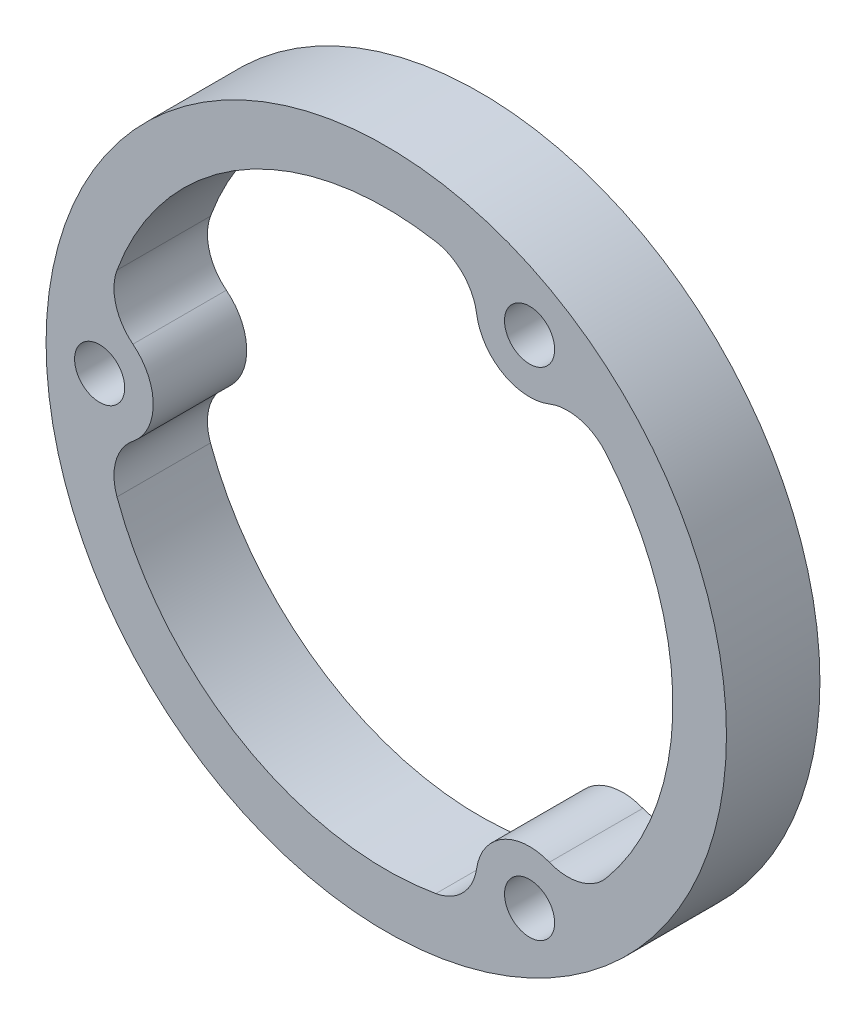
ISO-10303-21;
HEADER;
FILE_DESCRIPTION(('STEP AP214'),'2;1');
FILE_NAME('part.step','',(''),(''),'','','');
FILE_SCHEMA(('AUTOMOTIVE_DESIGN { 1 0 10303 214 1 1 1 1 }'));
ENDSEC;
DATA;
#1=APPLICATION_CONTEXT('core data for automotive mechanical design processes');
#2=APPLICATION_PROTOCOL_DEFINITION('international standard','automotive_design',2000,#1);
#3=PRODUCT_CONTEXT('',#1,'mechanical');
#4=PRODUCT('Part','Part','',(#3));
#5=PRODUCT_RELATED_PRODUCT_CATEGORY('part','',(#4));
#6=PRODUCT_DEFINITION_FORMATION('','',#4);
#7=PRODUCT_DEFINITION_CONTEXT('part definition',#1,'design');
#8=PRODUCT_DEFINITION('design','',#6,#7);
#9=PRODUCT_DEFINITION_SHAPE('','',#8);
#10=(LENGTH_UNIT() NAMED_UNIT(*) SI_UNIT(.MILLI.,.METRE.));
#11=(NAMED_UNIT(*) PLANE_ANGLE_UNIT() SI_UNIT($,.RADIAN.));
#12=(NAMED_UNIT(*) SI_UNIT($,.STERADIAN.) SOLID_ANGLE_UNIT());
#13=UNCERTAINTY_MEASURE_WITH_UNIT(LENGTH_MEASURE(1.E-05),#10,'distance_accuracy_value','');
#14=(GEOMETRIC_REPRESENTATION_CONTEXT(3) GLOBAL_UNCERTAINTY_ASSIGNED_CONTEXT((#13)) GLOBAL_UNIT_ASSIGNED_CONTEXT((#10,
#11,#12)) REPRESENTATION_CONTEXT('',''));
#15=CARTESIAN_POINT('',(0.,0.,0.));
#16=DIRECTION('',(0.,0.,1.));
#17=DIRECTION('',(1.,0.,0.));
#18=AXIS2_PLACEMENT_3D('',#15,#16,#17);
#19=CARTESIAN_POINT('',(0.,0.,9.525));
#20=DIRECTION('',(0.,0.,1.));
#21=DIRECTION('',(1.,0.,0.));
#22=AXIS2_PLACEMENT_3D('',#19,#20,#21);
#23=PLANE('',#22);
#24=CARTESIAN_POINT('',(14.6049999999998,25.2966020445436,9.525));
#25=DIRECTION('',(0.,0.,1.));
#26=DIRECTION('',(1.,0.,0.));
#27=AXIS2_PLACEMENT_3D('',#24,#25,#26);
#28=CIRCLE('',#27,2.5527);
#29=CARTESIAN_POINT('',(17.1576999999998,25.2966020445436,9.525));
#30=VERTEX_POINT('',#29);
#31=EDGE_CURVE('E484',#30,#30,#28,.T.);
#32=ORIENTED_EDGE('',*,*,#31,.F.);
#33=EDGE_LOOP('',(#32));
#34=FACE_BOUND('',#33,.T.);
#35=CARTESIAN_POINT('',(-29.2100000000011,1.58843043085777E-12,9.525));
#36=DIRECTION('',(0.,0.,1.));
#37=DIRECTION('',(1.,0.,0.));
#38=AXIS2_PLACEMENT_3D('',#35,#36,#37);
#39=CIRCLE('',#38,2.5527);
#40=CARTESIAN_POINT('',(-26.6573000000011,1.58843043085777E-12,9.525));
#41=VERTEX_POINT('',#40);
#42=EDGE_CURVE('E488',#41,#41,#39,.T.);
#43=ORIENTED_EDGE('',*,*,#42,.F.);
#44=EDGE_LOOP('',(#43));
#45=FACE_BOUND('',#44,.T.);
#46=CARTESIAN_POINT('',(14.6049999999981,-25.2966020445433,9.525));
#47=DIRECTION('',(0.,0.,1.));
#48=DIRECTION('',(1.,0.,0.));
#49=AXIS2_PLACEMENT_3D('',#46,#47,#48);
#50=CIRCLE('',#49,2.5527);
#51=CARTESIAN_POINT('',(17.1576999999981,-25.2966020445433,9.525));
#52=VERTEX_POINT('',#51);
#53=EDGE_CURVE('E501',#52,#52,#50,.T.);
#54=ORIENTED_EDGE('',*,*,#53,.F.);
#55=EDGE_LOOP('',(#54));
#56=FACE_BOUND('',#55,.T.);
#57=CARTESIAN_POINT('',(0.,0.,9.525));
#58=DIRECTION('',(0.,0.,1.));
#59=DIRECTION('',(1.,0.,0.));
#60=AXIS2_PLACEMENT_3D('',#57,#58,#59);
#61=CIRCLE('',#60,34.671);
#62=CARTESIAN_POINT('',(-34.671,0.,9.525));
#63=VERTEX_POINT('',#62);
#64=EDGE_CURVE('E153',#63,#63,#61,.T.);
#65=ORIENTED_EDGE('',*,*,#64,.T.);
#66=EDGE_LOOP('',(#65));
#67=FACE_BOUND('',#66,.T.);
#68=CARTESIAN_POINT('',(-29.21,-4.21584989140911E-13,9.525));
#69=DIRECTION('',(0.,0.,-1.));
#70=DIRECTION('',(1.,0.,0.));
#71=AXIS2_PLACEMENT_3D('',#68,#69,#70);
#72=CIRCLE('',#71,5.46100000000001);
#73=CARTESIAN_POINT('',(-25.8216912257727,4.28274265517914,9.525));
#74=VERTEX_POINT('',#73);
#75=CARTESIAN_POINT('',(-25.8216912257726,-4.28274265517988,9.525));
#76=VERTEX_POINT('',#75);
#77=EDGE_CURVE('E214',#74,#76,#72,.T.);
#78=ORIENTED_EDGE('',*,*,#77,.F.);
#79=CARTESIAN_POINT('',(-22.6697760869566,8.26668931116012,9.525));
#80=DIRECTION('',(0.,0.,1.));
#81=DIRECTION('',(1.,0.,0.));
#82=AXIS2_PLACEMENT_3D('',#79,#80,#81);
#83=CIRCLE('',#82,5.08);
#84=CARTESIAN_POINT('',(-27.4423605263159,10.0070449556149,9.525));
#85=VERTEX_POINT('',#84);
#86=EDGE_CURVE('E198',#74,#85,#83,.F.);
#87=ORIENTED_EDGE('',*,*,#86,.T.);
#88=CARTESIAN_POINT('',(0.,0.,9.525));
#89=DIRECTION('',(0.,0.,1.));
#90=DIRECTION('',(1.,0.,0.));
#91=AXIS2_PLACEMENT_3D('',#88,#89,#90);
#92=CIRCLE('',#91,29.21);
#93=CARTESIAN_POINT('',(5.05482511478187,28.7693038334085,9.525));
#94=VERTEX_POINT('',#93);
#95=EDGE_CURVE('E149',#94,#85,#92,.T.);
#96=ORIENTED_EDGE('',*,*,#95,.F.);
#97=CARTESIAN_POINT('',(4.1757250948198,23.7659466449896,9.525));
#98=DIRECTION('',(0.,0.,1.));
#99=DIRECTION('',(1.,0.,0.));
#100=AXIS2_PLACEMENT_3D('',#97,#98,#99);
#101=CIRCLE('',#100,5.08);
#102=CARTESIAN_POINT('',(9.20188167562942,24.5036118977867,9.525));
#103=VERTEX_POINT('',#102);
#104=EDGE_CURVE('E139',#94,#103,#101,.F.);
#105=ORIENTED_EDGE('',*,*,#104,.T.);
#106=CARTESIAN_POINT('',(14.6049999999998,25.2966020445436,9.525));
#107=DIRECTION('',(0.,0.,-1.));
#108=DIRECTION('',(1.,0.,0.));
#109=AXIS2_PLACEMENT_3D('',#106,#107,#108);
#110=CIRCLE('',#109,5.46100000000001);
#111=CARTESIAN_POINT('',(16.6198095501428,20.2208692426073,9.525));
#112=VERTEX_POINT('',#111);
#113=EDGE_CURVE('E229',#112,#103,#110,.T.);
#114=ORIENTED_EDGE('',*,*,#113,.F.);
#115=CARTESIAN_POINT('',(18.4940509921363,15.4992573338293,9.525));
#116=DIRECTION('',(0.,0.,1.));
#117=DIRECTION('',(1.,0.,0.));
#118=AXIS2_PLACEMENT_3D('',#115,#116,#117);
#119=CIRCLE('',#118,5.08);
#120=CARTESIAN_POINT('',(22.3875354115334,18.7622588777934,9.525));
#121=VERTEX_POINT('',#120);
#122=EDGE_CURVE('E138',#112,#121,#119,.F.);
#123=ORIENTED_EDGE('',*,*,#122,.T.);
#124=CARTESIAN_POINT('',(0.,0.,9.525));
#125=DIRECTION('',(0.,0.,1.));
#126=DIRECTION('',(1.,0.,0.));
#127=AXIS2_PLACEMENT_3D('',#124,#125,#126);
#128=CIRCLE('',#127,29.21);
#129=CARTESIAN_POINT('',(22.3875354115337,-18.762258877793,9.525));
#130=VERTEX_POINT('',#129);
#131=EDGE_CURVE('E226',#130,#121,#128,.T.);
#132=ORIENTED_EDGE('',*,*,#131,.F.);
#133=CARTESIAN_POINT('',(18.4940509921366,-15.499257333829,9.525));
#134=DIRECTION('',(0.,0.,1.));
#135=DIRECTION('',(1.,0.,0.));
#136=AXIS2_PLACEMENT_3D('',#133,#134,#135);
#137=CIRCLE('',#136,5.08);
#138=CARTESIAN_POINT('',(16.6198095501431,-20.220869242607,9.525));
#139=VERTEX_POINT('',#138);
#140=EDGE_CURVE('E194',#130,#139,#137,.F.);
#141=ORIENTED_EDGE('',*,*,#140,.T.);
#142=CARTESIAN_POINT('',(14.6050000000001,-25.2966020445434,9.525));
#143=DIRECTION('',(0.,0.,-1.));
#144=DIRECTION('',(1.,0.,0.));
#145=AXIS2_PLACEMENT_3D('',#142,#143,#144);
#146=CIRCLE('',#145,5.46100000000001);
#147=CARTESIAN_POINT('',(9.20188167562977,-24.5036118977866,9.525));
#148=VERTEX_POINT('',#147);
#149=EDGE_CURVE('E218',#148,#139,#146,.T.);
#150=ORIENTED_EDGE('',*,*,#149,.F.);
#151=CARTESIAN_POINT('',(4.17572509482014,-23.7659466449895,9.525));
#152=DIRECTION('',(0.,0.,1.));
#153=DIRECTION('',(1.,0.,0.));
#154=AXIS2_PLACEMENT_3D('',#151,#152,#153);
#155=CIRCLE('',#154,5.08);
#156=CARTESIAN_POINT('',(5.05482511478227,-28.7693038334084,9.525));
#157=VERTEX_POINT('',#156);
#158=EDGE_CURVE('E190',#148,#157,#155,.F.);
#159=ORIENTED_EDGE('',*,*,#158,.T.);
#160=CARTESIAN_POINT('',(0.,0.,9.525));
#161=DIRECTION('',(0.,0.,1.));
#162=DIRECTION('',(1.,0.,0.));
#163=AXIS2_PLACEMENT_3D('',#160,#161,#162);
#164=CIRCLE('',#163,29.21);
#165=CARTESIAN_POINT('',(-27.4423605263156,-10.0070449556157,9.525));
#166=VERTEX_POINT('',#165);
#167=EDGE_CURVE('E216',#166,#157,#164,.T.);
#168=ORIENTED_EDGE('',*,*,#167,.F.);
#169=CARTESIAN_POINT('',(-22.6697760869564,-8.26668931116077,9.525));
#170=DIRECTION('',(0.,0.,1.));
#171=DIRECTION('',(1.,0.,0.));
#172=AXIS2_PLACEMENT_3D('',#169,#170,#171);
#173=CIRCLE('',#172,5.08);
#174=EDGE_CURVE('E12',#166,#76,#173,.F.);
#175=ORIENTED_EDGE('',*,*,#174,.T.);
#176=EDGE_LOOP('',(#78,#87,#96,#105,#114,#123,#132,#141,#150,#159,#168,#175));
#177=FACE_BOUND('',#176,.T.);
#178=ADVANCED_FACE('F39',(#34,#45,#56,#67,#177),#23,.T.);
#179=CARTESIAN_POINT('',(0.,0.,0.));
#180=DIRECTION('',(0.,0.,1.));
#181=DIRECTION('',(1.,0.,0.));
#182=AXIS2_PLACEMENT_3D('',#179,#180,#181);
#183=PLANE('',#182);
#184=CARTESIAN_POINT('',(14.6049999999998,25.2966020445436,0.));
#185=DIRECTION('',(0.,0.,-1.));
#186=DIRECTION('',(-1.,0.,0.));
#187=AXIS2_PLACEMENT_3D('',#184,#185,#186);
#188=CIRCLE('',#187,4.0005);
#189=CARTESIAN_POINT('',(10.6044999999998,25.2966020445436,0.));
#190=VERTEX_POINT('',#189);
#191=EDGE_CURVE('E507',#190,#190,#188,.T.);
#192=ORIENTED_EDGE('',*,*,#191,.F.);
#193=EDGE_LOOP('',(#192));
#194=FACE_BOUND('',#193,.T.);
#195=CARTESIAN_POINT('',(-29.2100000000011,1.58931775184226E-12,0.));
#196=DIRECTION('',(0.,0.,-1.));
#197=DIRECTION('',(-1.,0.,0.));
#198=AXIS2_PLACEMENT_3D('',#195,#196,#197);
#199=CIRCLE('',#198,4.00050000000221);
#200=CARTESIAN_POINT('',(-33.2105000000033,1.58931775184226E-12,0.));
#201=VERTEX_POINT('',#200);
#202=EDGE_CURVE('E513',#201,#201,#199,.T.);
#203=ORIENTED_EDGE('',*,*,#202,.F.);
#204=EDGE_LOOP('',(#203));
#205=FACE_BOUND('',#204,.T.);
#206=CARTESIAN_POINT('',(14.6049999999981,-25.2966020445433,0.));
#207=DIRECTION('',(0.,0.,-1.));
#208=DIRECTION('',(-1.,0.,0.));
#209=AXIS2_PLACEMENT_3D('',#206,#207,#208);
#210=CIRCLE('',#209,4.00050000000186);
#211=CARTESIAN_POINT('',(10.6044999999962,-25.2966020445433,0.));
#212=VERTEX_POINT('',#211);
#213=EDGE_CURVE('E504',#212,#212,#210,.T.);
#214=ORIENTED_EDGE('',*,*,#213,.F.);
#215=EDGE_LOOP('',(#214));
#216=FACE_BOUND('',#215,.T.);
#217=CARTESIAN_POINT('',(0.,0.,0.));
#218=DIRECTION('',(0.,0.,1.));
#219=DIRECTION('',(1.,0.,0.));
#220=AXIS2_PLACEMENT_3D('',#217,#218,#219);
#221=CIRCLE('',#220,34.671);
#222=CARTESIAN_POINT('',(-34.671,0.,0.));
#223=VERTEX_POINT('',#222);
#224=EDGE_CURVE('E158',#223,#223,#221,.T.);
#225=ORIENTED_EDGE('',*,*,#224,.F.);
#226=EDGE_LOOP('',(#225));
#227=FACE_BOUND('',#226,.T.);
#228=CARTESIAN_POINT('',(14.6049999999998,25.2966020445436,0.));
#229=DIRECTION('',(0.,0.,-1.));
#230=DIRECTION('',(1.,0.,0.));
#231=AXIS2_PLACEMENT_3D('',#228,#229,#230);
#232=CIRCLE('',#231,5.46100000000001);
#233=CARTESIAN_POINT('',(16.6198095501428,20.2208692426073,0.));
#234=VERTEX_POINT('',#233);
#235=CARTESIAN_POINT('',(9.20188167562942,24.5036118977867,0.));
#236=VERTEX_POINT('',#235);
#237=EDGE_CURVE('E131',#234,#236,#232,.T.);
#238=ORIENTED_EDGE('',*,*,#237,.T.);
#239=CARTESIAN_POINT('',(4.1757250948198,23.7659466449896,0.));
#240=DIRECTION('',(0.,0.,1.));
#241=DIRECTION('',(1.,0.,0.));
#242=AXIS2_PLACEMENT_3D('',#239,#240,#241);
#243=CIRCLE('',#242,5.08);
#244=CARTESIAN_POINT('',(5.05482511478187,28.7693038334085,0.));
#245=VERTEX_POINT('',#244);
#246=EDGE_CURVE('E184',#236,#245,#243,.T.);
#247=ORIENTED_EDGE('',*,*,#246,.T.);
#248=CARTESIAN_POINT('',(0.,0.,0.));
#249=DIRECTION('',(0.,0.,1.));
#250=DIRECTION('',(1.,0.,0.));
#251=AXIS2_PLACEMENT_3D('',#248,#249,#250);
#252=CIRCLE('',#251,29.21);
#253=CARTESIAN_POINT('',(-27.4423605263159,10.0070449556149,0.));
#254=VERTEX_POINT('',#253);
#255=EDGE_CURVE('E231',#245,#254,#252,.T.);
#256=ORIENTED_EDGE('',*,*,#255,.T.);
#257=CARTESIAN_POINT('',(-22.6697760869566,8.26668931116012,0.));
#258=DIRECTION('',(0.,0.,1.));
#259=DIRECTION('',(1.,0.,0.));
#260=AXIS2_PLACEMENT_3D('',#257,#258,#259);
#261=CIRCLE('',#260,5.08);
#262=CARTESIAN_POINT('',(-25.8216912257727,4.28274265517914,0.));
#263=VERTEX_POINT('',#262);
#264=EDGE_CURVE('E196',#254,#263,#261,.T.);
#265=ORIENTED_EDGE('',*,*,#264,.T.);
#266=CARTESIAN_POINT('',(-29.21,-4.21584989140911E-13,0.));
#267=DIRECTION('',(0.,0.,-1.));
#268=DIRECTION('',(1.,0.,0.));
#269=AXIS2_PLACEMENT_3D('',#266,#267,#268);
#270=CIRCLE('',#269,5.46100000000001);
#271=CARTESIAN_POINT('',(-25.8216912257726,-4.28274265517988,0.));
#272=VERTEX_POINT('',#271);
#273=EDGE_CURVE('E203',#263,#272,#270,.T.);
#274=ORIENTED_EDGE('',*,*,#273,.T.);
#275=CARTESIAN_POINT('',(-22.6697760869564,-8.26668931116077,0.));
#276=DIRECTION('',(0.,0.,1.));
#277=DIRECTION('',(1.,0.,0.));
#278=AXIS2_PLACEMENT_3D('',#275,#276,#277);
#279=CIRCLE('',#278,5.08);
#280=CARTESIAN_POINT('',(-27.4423605263156,-10.0070449556157,0.));
#281=VERTEX_POINT('',#280);
#282=EDGE_CURVE('E47',#272,#281,#279,.T.);
#283=ORIENTED_EDGE('',*,*,#282,.T.);
#284=CARTESIAN_POINT('',(0.,0.,0.));
#285=DIRECTION('',(0.,0.,1.));
#286=DIRECTION('',(1.,0.,0.));
#287=AXIS2_PLACEMENT_3D('',#284,#285,#286);
#288=CIRCLE('',#287,29.21);
#289=CARTESIAN_POINT('',(5.05482511478227,-28.7693038334084,0.));
#290=VERTEX_POINT('',#289);
#291=EDGE_CURVE('E202',#281,#290,#288,.T.);
#292=ORIENTED_EDGE('',*,*,#291,.T.);
#293=CARTESIAN_POINT('',(4.17572509482014,-23.7659466449895,0.));
#294=DIRECTION('',(0.,0.,1.));
#295=DIRECTION('',(1.,0.,0.));
#296=AXIS2_PLACEMENT_3D('',#293,#294,#295);
#297=CIRCLE('',#296,5.08);
#298=CARTESIAN_POINT('',(9.20188167562977,-24.5036118977866,0.));
#299=VERTEX_POINT('',#298);
#300=EDGE_CURVE('E188',#290,#299,#297,.T.);
#301=ORIENTED_EDGE('',*,*,#300,.T.);
#302=CARTESIAN_POINT('',(14.6050000000001,-25.2966020445434,0.));
#303=DIRECTION('',(0.,0.,-1.));
#304=DIRECTION('',(1.,0.,0.));
#305=AXIS2_PLACEMENT_3D('',#302,#303,#304);
#306=CIRCLE('',#305,5.46100000000001);
#307=CARTESIAN_POINT('',(16.6198095501431,-20.220869242607,0.));
#308=VERTEX_POINT('',#307);
#309=EDGE_CURVE('E211',#299,#308,#306,.T.);
#310=ORIENTED_EDGE('',*,*,#309,.T.);
#311=CARTESIAN_POINT('',(18.4940509921366,-15.499257333829,0.));
#312=DIRECTION('',(0.,0.,1.));
#313=DIRECTION('',(1.,0.,0.));
#314=AXIS2_PLACEMENT_3D('',#311,#312,#313);
#315=CIRCLE('',#314,5.08);
#316=CARTESIAN_POINT('',(22.3875354115337,-18.762258877793,0.));
#317=VERTEX_POINT('',#316);
#318=EDGE_CURVE('E192',#308,#317,#315,.T.);
#319=ORIENTED_EDGE('',*,*,#318,.T.);
#320=CARTESIAN_POINT('',(0.,0.,0.));
#321=DIRECTION('',(0.,0.,1.));
#322=DIRECTION('',(1.,0.,0.));
#323=AXIS2_PLACEMENT_3D('',#320,#321,#322);
#324=CIRCLE('',#323,29.21);
#325=CARTESIAN_POINT('',(22.3875354115334,18.7622588777934,0.));
#326=VERTEX_POINT('',#325);
#327=EDGE_CURVE('E133',#317,#326,#324,.T.);
#328=ORIENTED_EDGE('',*,*,#327,.T.);
#329=CARTESIAN_POINT('',(18.4940509921363,15.4992573338293,0.));
#330=DIRECTION('',(0.,0.,1.));
#331=DIRECTION('',(1.,0.,0.));
#332=AXIS2_PLACEMENT_3D('',#329,#330,#331);
#333=CIRCLE('',#332,5.08);
#334=EDGE_CURVE('E128',#326,#234,#333,.T.);
#335=ORIENTED_EDGE('',*,*,#334,.T.);
#336=EDGE_LOOP('',(#238,#247,#256,#265,#274,#283,#292,#301,#310,#319,#328,#335));
#337=FACE_BOUND('',#336,.T.);
#338=ADVANCED_FACE('F130',(#194,#205,#216,#227,#337),#183,.F.);
#339=CARTESIAN_POINT('',(0.,0.,9.525));
#340=DIRECTION('',(0.,0.,-1.));
#341=DIRECTION('',(-1.,0.,0.));
#342=AXIS2_PLACEMENT_3D('',#339,#340,#341);
#343=CYLINDRICAL_SURFACE('',#342,34.671);
#344=CARTESIAN_POINT('',(-34.671,0.,9.525));
#345=CARTESIAN_POINT('',(-34.671,0.,9.42578125));
#346=CARTESIAN_POINT('',(-34.671,0.,9.3265625));
#347=CARTESIAN_POINT('',(-34.671,0.,9.128125));
#348=CARTESIAN_POINT('',(-34.671,0.,9.02890625));
#349=CARTESIAN_POINT('',(-34.671,0.,8.83046875));
#350=CARTESIAN_POINT('',(-34.671,0.,8.73125));
#351=CARTESIAN_POINT('',(-34.671,0.,8.5328125));
#352=CARTESIAN_POINT('',(-34.671,0.,8.43359375));
#353=CARTESIAN_POINT('',(-34.671,0.,8.23515625));
#354=CARTESIAN_POINT('',(-34.671,0.,8.1359375));
#355=CARTESIAN_POINT('',(-34.671,0.,7.9375));
#356=CARTESIAN_POINT('',(-34.671,0.,7.83828125));
#357=CARTESIAN_POINT('',(-34.671,0.,7.63984375));
#358=CARTESIAN_POINT('',(-34.671,0.,7.540625));
#359=CARTESIAN_POINT('',(-34.671,0.,7.3421875));
#360=CARTESIAN_POINT('',(-34.671,0.,7.24296875));
#361=CARTESIAN_POINT('',(-34.671,0.,7.04453125));
#362=CARTESIAN_POINT('',(-34.671,0.,6.9453125));
#363=CARTESIAN_POINT('',(-34.671,0.,6.746875));
#364=CARTESIAN_POINT('',(-34.671,0.,6.64765625));
#365=CARTESIAN_POINT('',(-34.671,0.,6.44921875));
#366=CARTESIAN_POINT('',(-34.671,0.,6.35));
#367=CARTESIAN_POINT('',(-34.671,0.,6.1515625));
#368=CARTESIAN_POINT('',(-34.671,0.,6.05234375));
#369=CARTESIAN_POINT('',(-34.671,0.,5.85390625));
#370=CARTESIAN_POINT('',(-34.671,0.,5.7546875));
#371=CARTESIAN_POINT('',(-34.671,0.,5.55625));
#372=CARTESIAN_POINT('',(-34.671,0.,5.45703125));
#373=CARTESIAN_POINT('',(-34.671,0.,5.25859375));
#374=CARTESIAN_POINT('',(-34.671,0.,5.159375));
#375=CARTESIAN_POINT('',(-34.671,0.,4.9609375));
#376=CARTESIAN_POINT('',(-34.671,0.,4.86171875));
#377=CARTESIAN_POINT('',(-34.671,0.,4.66328125));
#378=CARTESIAN_POINT('',(-34.671,0.,4.5640625));
#379=CARTESIAN_POINT('',(-34.671,0.,4.365625));
#380=CARTESIAN_POINT('',(-34.671,0.,4.26640625));
#381=CARTESIAN_POINT('',(-34.671,0.,4.06796875));
#382=CARTESIAN_POINT('',(-34.671,0.,3.96875));
#383=CARTESIAN_POINT('',(-34.671,0.,3.7703125));
#384=CARTESIAN_POINT('',(-34.671,0.,3.67109375));
#385=CARTESIAN_POINT('',(-34.671,0.,3.47265625));
#386=CARTESIAN_POINT('',(-34.671,0.,3.3734375));
#387=CARTESIAN_POINT('',(-34.671,0.,3.175));
#388=CARTESIAN_POINT('',(-34.671,0.,3.07578125));
#389=CARTESIAN_POINT('',(-34.671,0.,2.87734375));
#390=CARTESIAN_POINT('',(-34.671,0.,2.778125));
#391=CARTESIAN_POINT('',(-34.671,0.,2.5796875));
#392=CARTESIAN_POINT('',(-34.671,0.,2.48046875));
#393=CARTESIAN_POINT('',(-34.671,0.,2.28203125));
#394=CARTESIAN_POINT('',(-34.671,0.,2.1828125));
#395=CARTESIAN_POINT('',(-34.671,0.,1.984375));
#396=CARTESIAN_POINT('',(-34.671,0.,1.88515625));
#397=CARTESIAN_POINT('',(-34.671,0.,1.68671875));
#398=CARTESIAN_POINT('',(-34.671,0.,1.5875));
#399=CARTESIAN_POINT('',(-34.671,0.,1.3890625));
#400=CARTESIAN_POINT('',(-34.671,0.,1.28984375));
#401=CARTESIAN_POINT('',(-34.671,0.,1.09140625));
#402=CARTESIAN_POINT('',(-34.671,0.,0.992187500000001));
#403=CARTESIAN_POINT('',(-34.671,0.,0.793750000000001));
#404=CARTESIAN_POINT('',(-34.671,0.,0.69453125));
#405=CARTESIAN_POINT('',(-34.671,0.,0.49609375));
#406=CARTESIAN_POINT('',(-34.671,0.,0.396875));
#407=CARTESIAN_POINT('',(-34.671,0.,0.1984375));
#408=CARTESIAN_POINT('',(-34.671,0.,0.0992187500000001));
#409=CARTESIAN_POINT('',(-34.671,0.,0.));
#410=B_SPLINE_CURVE_WITH_KNOTS('',3,(#344,#345,#346,#347,#348,#349,#350,#351,#352,#353,#354,
#355,#356,#357,#358,#359,#360,#361,#362,#363,#364,#365,#366,#367,#368,#369,#370,#371,#372,#373,
#374,#375,#376,#377,#378,#379,#380,#381,#382,#383,#384,#385,#386,#387,#388,#389,#390,#391,#392,
#393,#394,#395,#396,#397,#398,#399,#400,#401,#402,#403,#404,#405,#406,#407,#408,#409),
.UNSPECIFIED.,.F.,.F.,(4,2,2,2,2,2,2,2,2,2,2,2,2,2,2,2,2,2,2,2,2,2,2,2,2,2,2,2,2,2,2,2,4),(0.,
0.297656249999998,0.595312499999999,0.892968749999999,1.190625,1.48828125,1.7859375,2.08359375,
2.38125,2.67890625,2.9765625,3.27421875,3.571875,3.86953125,4.1671875,4.46484375,4.7625,
5.06015625,5.3578125,5.65546875,5.953125,6.25078125,6.5484375,6.84609375,7.14375,7.44140625,
7.7390625,8.03671875,8.334375,8.63203125,8.9296875,9.22734375,9.525),.UNSPECIFIED.);
#411=EDGE_CURVE('BSEAM278',#63,#223,#410,.T.);
#412=ORIENTED_EDGE('',*,*,#64,.F.);
#413=ORIENTED_EDGE('',*,*,#224,.T.);
#414=ORIENTED_EDGE('',*,*,#411,.T.);
#415=ORIENTED_EDGE('',*,*,#411,.F.);
#416=EDGE_LOOP('',(#412,#414,#413,#415));
#417=FACE_BOUND('',#416,.T.);
#418=ADVANCED_FACE('F278',(#417),#343,.T.);
#419=CARTESIAN_POINT('',(0.,0.,9.525));
#420=DIRECTION('',(0.,0.,-1.));
#421=DIRECTION('',(-1.,0.,0.));
#422=AXIS2_PLACEMENT_3D('',#419,#420,#421);
#423=CYLINDRICAL_SURFACE('',#422,29.21);
#424=ORIENTED_EDGE('',*,*,#255,.F.);
#425=DIRECTION('',(0.,0.,-1.));
#426=VECTOR('',#425,1.);
#427=CARTESIAN_POINT('',(5.05482511478187,28.7693038334085,9.525));
#428=LINE('',#427,#426);
#429=EDGE_CURVE('E164',#245,#94,#428,.F.);
#430=ORIENTED_EDGE('',*,*,#429,.T.);
#431=ORIENTED_EDGE('',*,*,#95,.T.);
#432=DIRECTION('',(0.,0.,-1.));
#433=VECTOR('',#432,1.);
#434=CARTESIAN_POINT('',(-27.4423605263159,10.0070449556149,9.525));
#435=LINE('',#434,#433);
#436=EDGE_CURVE('E155',#85,#254,#435,.T.);
#437=ORIENTED_EDGE('',*,*,#436,.T.);
#438=EDGE_LOOP('',(#424,#430,#431,#437));
#439=FACE_BOUND('',#438,.T.);
#440=ADVANCED_FACE('F261',(#439),#423,.F.);
#441=CARTESIAN_POINT('',(-29.21,-4.21584989140911E-13,9.525));
#442=DIRECTION('',(0.,0.,-1.));
#443=DIRECTION('',(-1.,0.,0.));
#444=AXIS2_PLACEMENT_3D('',#441,#442,#443);
#445=CYLINDRICAL_SURFACE('',#444,5.46100000000001);
#446=ORIENTED_EDGE('',*,*,#273,.F.);
#447=DIRECTION('',(0.,0.,-1.));
#448=VECTOR('',#447,1.);
#449=CARTESIAN_POINT('',(-25.8216912257727,4.28274265517914,9.525));
#450=LINE('',#449,#448);
#451=EDGE_CURVE('E59',#263,#74,#450,.F.);
#452=ORIENTED_EDGE('',*,*,#451,.T.);
#453=ORIENTED_EDGE('',*,*,#77,.T.);
#454=DIRECTION('',(0.,0.,-1.));
#455=VECTOR('',#454,1.);
#456=CARTESIAN_POINT('',(-25.8216912257726,-4.28274265517988,9.525));
#457=LINE('',#456,#455);
#458=EDGE_CURVE('E180',#76,#272,#457,.T.);
#459=ORIENTED_EDGE('',*,*,#458,.T.);
#460=EDGE_LOOP('',(#446,#452,#453,#459));
#461=FACE_BOUND('',#460,.T.);
#462=ADVANCED_FACE('F213',(#461),#445,.T.);
#463=CARTESIAN_POINT('',(0.,0.,9.525));
#464=DIRECTION('',(0.,0.,-1.));
#465=DIRECTION('',(-1.,0.,0.));
#466=AXIS2_PLACEMENT_3D('',#463,#464,#465);
#467=CYLINDRICAL_SURFACE('',#466,29.21);
#468=ORIENTED_EDGE('',*,*,#167,.T.);
#469=DIRECTION('',(0.,0.,-1.));
#470=VECTOR('',#469,1.);
#471=CARTESIAN_POINT('',(5.05482511478227,-28.7693038334084,9.525));
#472=LINE('',#471,#470);
#473=EDGE_CURVE('E172',#157,#290,#472,.T.);
#474=ORIENTED_EDGE('',*,*,#473,.T.);
#475=ORIENTED_EDGE('',*,*,#291,.F.);
#476=DIRECTION('',(0.,0.,-1.));
#477=VECTOR('',#476,1.);
#478=CARTESIAN_POINT('',(-27.4423605263156,-10.0070449556157,9.525));
#479=LINE('',#478,#477);
#480=EDGE_CURVE('E170',#281,#166,#479,.F.);
#481=ORIENTED_EDGE('',*,*,#480,.T.);
#482=EDGE_LOOP('',(#468,#474,#475,#481));
#483=FACE_BOUND('',#482,.T.);
#484=ADVANCED_FACE('F209',(#483),#467,.F.);
#485=CARTESIAN_POINT('',(14.6050000000001,-25.2966020445434,9.525));
#486=DIRECTION('',(0.,0.,-1.));
#487=DIRECTION('',(-1.,0.,0.));
#488=AXIS2_PLACEMENT_3D('',#485,#486,#487);
#489=CYLINDRICAL_SURFACE('',#488,5.46100000000001);
#490=ORIENTED_EDGE('',*,*,#309,.F.);
#491=DIRECTION('',(0.,0.,-1.));
#492=VECTOR('',#491,1.);
#493=CARTESIAN_POINT('',(9.20188167562977,-24.5036118977866,9.525));
#494=LINE('',#493,#492);
#495=EDGE_CURVE('E178',#299,#148,#494,.F.);
#496=ORIENTED_EDGE('',*,*,#495,.T.);
#497=ORIENTED_EDGE('',*,*,#149,.T.);
#498=DIRECTION('',(0.,0.,-1.));
#499=VECTOR('',#498,1.);
#500=CARTESIAN_POINT('',(16.6198095501431,-20.220869242607,9.525));
#501=LINE('',#500,#499);
#502=EDGE_CURVE('E175',#139,#308,#501,.T.);
#503=ORIENTED_EDGE('',*,*,#502,.T.);
#504=EDGE_LOOP('',(#490,#496,#497,#503));
#505=FACE_BOUND('',#504,.T.);
#506=ADVANCED_FACE('F241',(#505),#489,.T.);
#507=CARTESIAN_POINT('',(0.,0.,9.525));
#508=DIRECTION('',(0.,0.,-1.));
#509=DIRECTION('',(-1.,0.,0.));
#510=AXIS2_PLACEMENT_3D('',#507,#508,#509);
#511=CYLINDRICAL_SURFACE('',#510,29.21);
#512=ORIENTED_EDGE('',*,*,#131,.T.);
#513=DIRECTION('',(0.,0.,-1.));
#514=VECTOR('',#513,1.);
#515=CARTESIAN_POINT('',(22.3875354115334,18.7622588777934,9.525));
#516=LINE('',#515,#514);
#517=EDGE_CURVE('E168',#121,#326,#516,.T.);
#518=ORIENTED_EDGE('',*,*,#517,.T.);
#519=ORIENTED_EDGE('',*,*,#327,.F.);
#520=DIRECTION('',(0.,0.,-1.));
#521=VECTOR('',#520,1.);
#522=CARTESIAN_POINT('',(22.3875354115337,-18.762258877793,9.525));
#523=LINE('',#522,#521);
#524=EDGE_CURVE('E166',#317,#130,#523,.F.);
#525=ORIENTED_EDGE('',*,*,#524,.T.);
#526=EDGE_LOOP('',(#512,#518,#519,#525));
#527=FACE_BOUND('',#526,.T.);
#528=ADVANCED_FACE('F253',(#527),#511,.F.);
#529=CARTESIAN_POINT('',(14.6049999999998,25.2966020445436,9.525));
#530=DIRECTION('',(0.,0.,-1.));
#531=DIRECTION('',(-1.,0.,0.));
#532=AXIS2_PLACEMENT_3D('',#529,#530,#531);
#533=CYLINDRICAL_SURFACE('',#532,5.46100000000001);
#534=ORIENTED_EDGE('',*,*,#113,.T.);
#535=DIRECTION('',(0.,0.,-1.));
#536=VECTOR('',#535,1.);
#537=CARTESIAN_POINT('',(9.20188167562942,24.5036118977867,9.525));
#538=LINE('',#537,#536);
#539=EDGE_CURVE('E148',#103,#236,#538,.T.);
#540=ORIENTED_EDGE('',*,*,#539,.T.);
#541=ORIENTED_EDGE('',*,*,#237,.F.);
#542=DIRECTION('',(0.,0.,-1.));
#543=VECTOR('',#542,1.);
#544=CARTESIAN_POINT('',(16.6198095501428,20.2208692426073,9.525));
#545=LINE('',#544,#543);
#546=EDGE_CURVE('E145',#234,#112,#545,.F.);
#547=ORIENTED_EDGE('',*,*,#546,.T.);
#548=EDGE_LOOP('',(#534,#540,#541,#547));
#549=FACE_BOUND('',#548,.T.);
#550=ADVANCED_FACE('F144',(#549),#533,.T.);
#551=CARTESIAN_POINT('',(4.1757250948198,23.7659466449896,9.525));
#552=DIRECTION('',(0.,0.,-1.));
#553=DIRECTION('',(-1.,0.,0.));
#554=AXIS2_PLACEMENT_3D('',#551,#552,#553);
#555=CYLINDRICAL_SURFACE('',#554,5.08);
#556=ORIENTED_EDGE('',*,*,#104,.F.);
#557=ORIENTED_EDGE('',*,*,#429,.F.);
#558=ORIENTED_EDGE('',*,*,#246,.F.);
#559=ORIENTED_EDGE('',*,*,#539,.F.);
#560=EDGE_LOOP('',(#556,#557,#558,#559));
#561=FACE_BOUND('',#560,.T.);
#562=ADVANCED_FACE('F257',(#561),#555,.F.);
#563=CARTESIAN_POINT('',(18.4940509921363,15.4992573338293,9.525));
#564=DIRECTION('',(0.,0.,-1.));
#565=DIRECTION('',(-1.,0.,0.));
#566=AXIS2_PLACEMENT_3D('',#563,#564,#565);
#567=CYLINDRICAL_SURFACE('',#566,5.08);
#568=ORIENTED_EDGE('',*,*,#122,.F.);
#569=ORIENTED_EDGE('',*,*,#546,.F.);
#570=ORIENTED_EDGE('',*,*,#334,.F.);
#571=ORIENTED_EDGE('',*,*,#517,.F.);
#572=EDGE_LOOP('',(#568,#569,#570,#571));
#573=FACE_BOUND('',#572,.T.);
#574=ADVANCED_FACE('F152',(#573),#567,.F.);
#575=CARTESIAN_POINT('',(4.17572509482014,-23.7659466449895,9.525));
#576=DIRECTION('',(0.,0.,-1.));
#577=DIRECTION('',(-1.,0.,0.));
#578=AXIS2_PLACEMENT_3D('',#575,#576,#577);
#579=CYLINDRICAL_SURFACE('',#578,5.08);
#580=ORIENTED_EDGE('',*,*,#158,.F.);
#581=ORIENTED_EDGE('',*,*,#495,.F.);
#582=ORIENTED_EDGE('',*,*,#300,.F.);
#583=ORIENTED_EDGE('',*,*,#473,.F.);
#584=EDGE_LOOP('',(#580,#581,#582,#583));
#585=FACE_BOUND('',#584,.T.);
#586=ADVANCED_FACE('F246',(#585),#579,.F.);
#587=CARTESIAN_POINT('',(18.4940509921366,-15.499257333829,9.525));
#588=DIRECTION('',(0.,0.,-1.));
#589=DIRECTION('',(-1.,0.,0.));
#590=AXIS2_PLACEMENT_3D('',#587,#588,#589);
#591=CYLINDRICAL_SURFACE('',#590,5.08);
#592=ORIENTED_EDGE('',*,*,#140,.F.);
#593=ORIENTED_EDGE('',*,*,#524,.F.);
#594=ORIENTED_EDGE('',*,*,#318,.F.);
#595=ORIENTED_EDGE('',*,*,#502,.F.);
#596=EDGE_LOOP('',(#592,#593,#594,#595));
#597=FACE_BOUND('',#596,.T.);
#598=ADVANCED_FACE('F250',(#597),#591,.F.);
#599=CARTESIAN_POINT('',(-22.6697760869566,8.26668931116012,9.525));
#600=DIRECTION('',(0.,0.,-1.));
#601=DIRECTION('',(-1.,0.,0.));
#602=AXIS2_PLACEMENT_3D('',#599,#600,#601);
#603=CYLINDRICAL_SURFACE('',#602,5.08);
#604=ORIENTED_EDGE('',*,*,#86,.F.);
#605=ORIENTED_EDGE('',*,*,#451,.F.);
#606=ORIENTED_EDGE('',*,*,#264,.F.);
#607=ORIENTED_EDGE('',*,*,#436,.F.);
#608=EDGE_LOOP('',(#604,#605,#606,#607));
#609=FACE_BOUND('',#608,.T.);
#610=ADVANCED_FACE('F264',(#609),#603,.F.);
#611=CARTESIAN_POINT('',(-22.6697760869564,-8.26668931116077,9.525));
#612=DIRECTION('',(0.,0.,-1.));
#613=DIRECTION('',(-1.,0.,0.));
#614=AXIS2_PLACEMENT_3D('',#611,#612,#613);
#615=CYLINDRICAL_SURFACE('',#614,5.08);
#616=ORIENTED_EDGE('',*,*,#174,.F.);
#617=ORIENTED_EDGE('',*,*,#480,.F.);
#618=ORIENTED_EDGE('',*,*,#282,.F.);
#619=ORIENTED_EDGE('',*,*,#458,.F.);
#620=EDGE_LOOP('',(#616,#617,#618,#619));
#621=FACE_BOUND('',#620,.T.);
#622=ADVANCED_FACE('F41',(#621),#615,.F.);
#623=CARTESIAN_POINT('',(14.6049999999981,-25.2966020445433,5.08));
#624=DIRECTION('',(0.,0.,-1.));
#625=DIRECTION('',(-1.,0.,0.));
#626=AXIS2_PLACEMENT_3D('',#623,#624,#625);
#627=CYLINDRICAL_SURFACE('',#626,4.00050000000186);
#628=CARTESIAN_POINT('',(14.6049999999981,-25.2966020445433,5.08));
#629=DIRECTION('',(0.,0.,-1.));
#630=DIRECTION('',(-1.,0.,0.));
#631=AXIS2_PLACEMENT_3D('',#628,#629,#630);
#632=CIRCLE('',#631,4.00050000000186);
#633=CARTESIAN_POINT('',(10.6044999999962,-25.2966020445433,5.08));
#634=VERTEX_POINT('',#633);
#635=EDGE_CURVE('E516',#634,#634,#632,.T.);
#636=ORIENTED_EDGE('',*,*,#635,.F.);
#637=EDGE_LOOP('',(#636));
#638=FACE_BOUND('',#637,.T.);
#639=ORIENTED_EDGE('',*,*,#213,.T.);
#640=EDGE_LOOP('',(#639));
#641=FACE_BOUND('',#640,.T.);
#642=ADVANCED_FACE('F270',(#638,#641),#627,.F.);
#643=CARTESIAN_POINT('',(14.6049999999981,-25.2966020445433,5.08));
#644=DIRECTION('',(0.,0.,-1.));
#645=DIRECTION('',(-1.,0.,0.));
#646=AXIS2_PLACEMENT_3D('',#643,#644,#645);
#647=PLANE('',#646);
#648=CARTESIAN_POINT('',(14.6049999999981,-25.2966020445433,5.08));
#649=DIRECTION('',(0.,0.,-1.));
#650=DIRECTION('',(-1.,0.,0.));
#651=AXIS2_PLACEMENT_3D('',#648,#649,#650);
#652=CIRCLE('',#651,2.5527);
#653=CARTESIAN_POINT('',(12.0522999999981,-25.2966020445433,5.08));
#654=VERTEX_POINT('',#653);
#655=EDGE_CURVE('E497',#654,#654,#652,.T.);
#656=ORIENTED_EDGE('',*,*,#655,.F.);
#657=EDGE_LOOP('',(#656));
#658=FACE_BOUND('',#657,.T.);
#659=ORIENTED_EDGE('',*,*,#635,.T.);
#660=EDGE_LOOP('',(#659));
#661=FACE_BOUND('',#660,.T.);
#662=ADVANCED_FACE('F329',(#658,#661),#647,.T.);
#663=CARTESIAN_POINT('',(-29.2100000000011,1.58931775184226E-12,5.08));
#664=DIRECTION('',(0.,0.,-1.));
#665=DIRECTION('',(-1.,0.,0.));
#666=AXIS2_PLACEMENT_3D('',#663,#664,#665);
#667=CYLINDRICAL_SURFACE('',#666,4.00050000000221);
#668=CARTESIAN_POINT('',(-29.2100000000011,1.58931775184226E-12,5.08));
#669=DIRECTION('',(0.,0.,-1.));
#670=DIRECTION('',(-1.,0.,0.));
#671=AXIS2_PLACEMENT_3D('',#668,#669,#670);
#672=CIRCLE('',#671,4.00050000000221);
#673=CARTESIAN_POINT('',(-33.2105000000033,1.58931775184226E-12,5.08));
#674=VERTEX_POINT('',#673);
#675=EDGE_CURVE('E510',#674,#674,#672,.T.);
#676=ORIENTED_EDGE('',*,*,#675,.F.);
#677=EDGE_LOOP('',(#676));
#678=FACE_BOUND('',#677,.T.);
#679=ORIENTED_EDGE('',*,*,#202,.T.);
#680=EDGE_LOOP('',(#679));
#681=FACE_BOUND('',#680,.T.);
#682=ADVANCED_FACE('F337',(#678,#681),#667,.F.);
#683=CARTESIAN_POINT('',(-29.2100000000011,1.58931775184226E-12,5.08));
#684=DIRECTION('',(0.,0.,-1.));
#685=DIRECTION('',(-1.,0.,0.));
#686=AXIS2_PLACEMENT_3D('',#683,#684,#685);
#687=PLANE('',#686);
#688=CARTESIAN_POINT('',(-29.2100000000011,1.58843043085777E-12,5.08));
#689=DIRECTION('',(0.,0.,-1.));
#690=DIRECTION('',(-1.,0.,0.));
#691=AXIS2_PLACEMENT_3D('',#688,#689,#690);
#692=CIRCLE('',#691,2.5527);
#693=CARTESIAN_POINT('',(-31.7627000000011,1.58843043085777E-12,5.08));
#694=VERTEX_POINT('',#693);
#695=EDGE_CURVE('E485',#694,#694,#692,.T.);
#696=ORIENTED_EDGE('',*,*,#695,.F.);
#697=EDGE_LOOP('',(#696));
#698=FACE_BOUND('',#697,.T.);
#699=ORIENTED_EDGE('',*,*,#675,.T.);
#700=EDGE_LOOP('',(#699));
#701=FACE_BOUND('',#700,.T.);
#702=ADVANCED_FACE('F342',(#698,#701),#687,.T.);
#703=CARTESIAN_POINT('',(14.6049999999998,25.2966020445436,5.08));
#704=DIRECTION('',(0.,0.,-1.));
#705=DIRECTION('',(-1.,0.,0.));
#706=AXIS2_PLACEMENT_3D('',#703,#704,#705);
#707=CYLINDRICAL_SURFACE('',#706,4.0005);
#708=CARTESIAN_POINT('',(14.6049999999998,25.2966020445436,5.08));
#709=DIRECTION('',(0.,0.,-1.));
#710=DIRECTION('',(-1.,0.,0.));
#711=AXIS2_PLACEMENT_3D('',#708,#709,#710);
#712=CIRCLE('',#711,4.0005);
#713=CARTESIAN_POINT('',(10.6044999999998,25.2966020445436,5.08));
#714=VERTEX_POINT('',#713);
#715=EDGE_CURVE('E234',#714,#714,#712,.T.);
#716=ORIENTED_EDGE('',*,*,#715,.F.);
#717=EDGE_LOOP('',(#716));
#718=FACE_BOUND('',#717,.T.);
#719=ORIENTED_EDGE('',*,*,#191,.T.);
#720=EDGE_LOOP('',(#719));
#721=FACE_BOUND('',#720,.T.);
#722=ADVANCED_FACE('F350',(#718,#721),#707,.F.);
#723=CARTESIAN_POINT('',(14.6049999999998,25.2966020445436,5.08));
#724=DIRECTION('',(0.,0.,-1.));
#725=DIRECTION('',(-1.,0.,0.));
#726=AXIS2_PLACEMENT_3D('',#723,#724,#725);
#727=PLANE('',#726);
#728=CARTESIAN_POINT('',(14.6049999999998,25.2966020445436,5.08));
#729=DIRECTION('',(0.,0.,-1.));
#730=DIRECTION('',(-1.,0.,0.));
#731=AXIS2_PLACEMENT_3D('',#728,#729,#730);
#732=CIRCLE('',#731,2.5527);
#733=CARTESIAN_POINT('',(12.0522999999998,25.2966020445436,5.08));
#734=VERTEX_POINT('',#733);
#735=EDGE_CURVE('E482',#734,#734,#732,.T.);
#736=ORIENTED_EDGE('',*,*,#735,.F.);
#737=EDGE_LOOP('',(#736));
#738=FACE_BOUND('',#737,.T.);
#739=ORIENTED_EDGE('',*,*,#715,.T.);
#740=EDGE_LOOP('',(#739));
#741=FACE_BOUND('',#740,.T.);
#742=ADVANCED_FACE('F354',(#738,#741),#727,.T.);
#743=CARTESIAN_POINT('',(14.6049999999981,-25.2966020445433,5.08));
#744=DIRECTION('',(0.,0.,-1.));
#745=DIRECTION('',(-1.,0.,0.));
#746=AXIS2_PLACEMENT_3D('',#743,#744,#745);
#747=CYLINDRICAL_SURFACE('',#746,2.5527);
#748=ORIENTED_EDGE('',*,*,#655,.T.);
#749=EDGE_LOOP('',(#748));
#750=FACE_BOUND('',#749,.T.);
#751=ORIENTED_EDGE('',*,*,#53,.T.);
#752=EDGE_LOOP('',(#751));
#753=FACE_BOUND('',#752,.T.);
#754=ADVANCED_FACE('F382',(#750,#753),#747,.F.);
#755=CARTESIAN_POINT('',(-29.2100000000011,1.58843043085777E-12,5.08));
#756=DIRECTION('',(0.,0.,-1.));
#757=DIRECTION('',(-1.,0.,0.));
#758=AXIS2_PLACEMENT_3D('',#755,#756,#757);
#759=CYLINDRICAL_SURFACE('',#758,2.5527);
#760=ORIENTED_EDGE('',*,*,#695,.T.);
#761=EDGE_LOOP('',(#760));
#762=FACE_BOUND('',#761,.T.);
#763=ORIENTED_EDGE('',*,*,#42,.T.);
#764=EDGE_LOOP('',(#763));
#765=FACE_BOUND('',#764,.T.);
#766=ADVANCED_FACE('F392',(#762,#765),#759,.F.);
#767=CARTESIAN_POINT('',(14.6049999999998,25.2966020445436,5.08));
#768=DIRECTION('',(0.,0.,-1.));
#769=DIRECTION('',(-1.,0.,0.));
#770=AXIS2_PLACEMENT_3D('',#767,#768,#769);
#771=CYLINDRICAL_SURFACE('',#770,2.5527);
#772=ORIENTED_EDGE('',*,*,#735,.T.);
#773=EDGE_LOOP('',(#772));
#774=FACE_BOUND('',#773,.T.);
#775=ORIENTED_EDGE('',*,*,#31,.T.);
#776=EDGE_LOOP('',(#775));
#777=FACE_BOUND('',#776,.T.);
#778=ADVANCED_FACE('F402',(#774,#777),#771,.F.);
#779=CLOSED_SHELL('',(#178,#338,#418,#440,#462,#484,#506,#528,#550,#562,#574,#586,#598,#610,
#622,#642,#662,#682,#702,#722,#742,#754,#766,#778));
#780=MANIFOLD_SOLID_BREP('B2',#779);
#781=ADVANCED_BREP_SHAPE_REPRESENTATION('',(#18,#780),#14);
#782=SHAPE_DEFINITION_REPRESENTATION(#9,#781);
ENDSEC;
END-ISO-10303-21;
